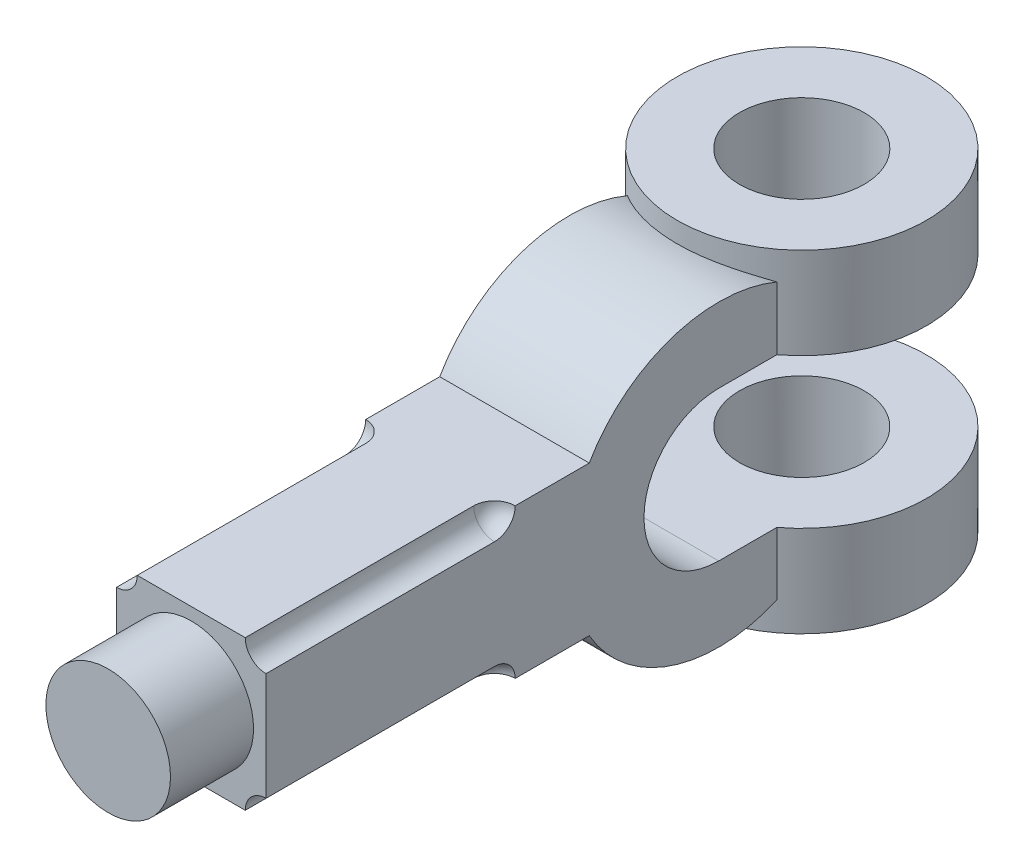
ISO-10303-21;
HEADER;
FILE_DESCRIPTION(('STEP AP214'),'2;1');
FILE_NAME('part.step','',(''),(''),'','','');
FILE_SCHEMA(('AUTOMOTIVE_DESIGN { 1 0 10303 214 1 1 1 1 }'));
ENDSEC;
DATA;
#1=APPLICATION_CONTEXT('core data for automotive mechanical design processes');
#2=APPLICATION_PROTOCOL_DEFINITION('international standard','automotive_design',2000,#1);
#3=PRODUCT_CONTEXT('',#1,'mechanical');
#4=PRODUCT('Part','Part','',(#3));
#5=PRODUCT_RELATED_PRODUCT_CATEGORY('part','',(#4));
#6=PRODUCT_DEFINITION_FORMATION('','',#4);
#7=PRODUCT_DEFINITION_CONTEXT('part definition',#1,'design');
#8=PRODUCT_DEFINITION('design','',#6,#7);
#9=PRODUCT_DEFINITION_SHAPE('','',#8);
#10=(LENGTH_UNIT() NAMED_UNIT(*) SI_UNIT(.MILLI.,.METRE.));
#11=(NAMED_UNIT(*) PLANE_ANGLE_UNIT() SI_UNIT($,.RADIAN.));
#12=(NAMED_UNIT(*) SI_UNIT($,.STERADIAN.) SOLID_ANGLE_UNIT());
#13=UNCERTAINTY_MEASURE_WITH_UNIT(LENGTH_MEASURE(1.E-05),#10,'distance_accuracy_value','');
#14=(GEOMETRIC_REPRESENTATION_CONTEXT(3) GLOBAL_UNCERTAINTY_ASSIGNED_CONTEXT((#13)) GLOBAL_UNIT_ASSIGNED_CONTEXT((#10,
#11,#12)) REPRESENTATION_CONTEXT('',''));
#15=CARTESIAN_POINT('',(0.,0.,0.));
#16=DIRECTION('',(0.,0.,1.));
#17=DIRECTION('',(1.,0.,0.));
#18=AXIS2_PLACEMENT_3D('',#15,#16,#17);
#19=CARTESIAN_POINT('',(-18.,18.,109.));
#20=DIRECTION('',(0.,-1.,0.));
#21=DIRECTION('',(0.,0.,-1.));
#22=AXIS2_PLACEMENT_3D('',#19,#20,#21);
#23=PLANE('',#22);
#24=DIRECTION('',(0.,0.,-1.));
#25=VECTOR('',#24,1.);
#26=CARTESIAN_POINT('',(-13.0000000000001,18.,129.));
#27=LINE('',#26,#25);
#28=CARTESIAN_POINT('',(-13.0000000000001,18.,109.));
#29=VERTEX_POINT('',#28);
#30=CARTESIAN_POINT('',(-13.0000000000001,18.,54.));
#31=VERTEX_POINT('',#30);
#32=EDGE_CURVE('E420',#29,#31,#27,.T.);
#33=ORIENTED_EDGE('',*,*,#32,.F.);
#34=DIRECTION('',(-1.,0.,0.));
#35=VECTOR('',#34,1.);
#36=CARTESIAN_POINT('',(-18.,18.,109.));
#37=LINE('',#36,#35);
#38=CARTESIAN_POINT('',(13.,18.,109.));
#39=VERTEX_POINT('',#38);
#40=EDGE_CURVE('E416',#39,#29,#37,.T.);
#41=ORIENTED_EDGE('',*,*,#40,.F.);
#42=DIRECTION('',(0.,0.,-1.));
#43=VECTOR('',#42,1.);
#44=CARTESIAN_POINT('',(13.,18.,129.));
#45=LINE('',#44,#43);
#46=CARTESIAN_POINT('',(13.,18.,54.));
#47=VERTEX_POINT('',#46);
#48=EDGE_CURVE('E225',#39,#47,#45,.T.);
#49=ORIENTED_EDGE('',*,*,#48,.T.);
#50=CARTESIAN_POINT('',(18.,18.,54.));
#51=DIRECTION('',(0.,-1.,0.));
#52=DIRECTION('',(0.,0.,-1.));
#53=AXIS2_PLACEMENT_3D('',#50,#51,#52);
#54=CIRCLE('',#53,5.);
#55=CARTESIAN_POINT('',(18.,18.,49.));
#56=VERTEX_POINT('',#55);
#57=EDGE_CURVE('E403',#47,#56,#54,.T.);
#58=ORIENTED_EDGE('',*,*,#57,.T.);
#59=DIRECTION('',(0.,0.,-1.));
#60=VECTOR('',#59,1.);
#61=CARTESIAN_POINT('',(18.,18.,109.));
#62=LINE('',#61,#60);
#63=CARTESIAN_POINT('',(18.,18.,31.1769145362398));
#64=VERTEX_POINT('',#63);
#65=EDGE_CURVE('E181',#56,#64,#62,.T.);
#66=ORIENTED_EDGE('',*,*,#65,.T.);
#67=DIRECTION('',(-1.,0.,0.));
#68=VECTOR('',#67,1.);
#69=CARTESIAN_POINT('',(18.,18.,31.1769145362398));
#70=LINE('',#69,#68);
#71=CARTESIAN_POINT('',(-18.,18.,31.1769145362398));
#72=VERTEX_POINT('',#71);
#73=EDGE_CURVE('E185',#64,#72,#70,.T.);
#74=ORIENTED_EDGE('',*,*,#73,.T.);
#75=DIRECTION('',(0.,0.,-1.));
#76=VECTOR('',#75,1.);
#77=CARTESIAN_POINT('',(-18.,18.,109.));
#78=LINE('',#77,#76);
#79=CARTESIAN_POINT('',(-18.0000000000001,17.9999999999999,49.));
#80=VERTEX_POINT('',#79);
#81=EDGE_CURVE('E167',#80,#72,#78,.T.);
#82=ORIENTED_EDGE('',*,*,#81,.F.);
#83=CARTESIAN_POINT('',(-18.0000000000001,18.,54.));
#84=DIRECTION('',(0.,-1.,0.));
#85=DIRECTION('',(0.,0.,-1.));
#86=AXIS2_PLACEMENT_3D('',#83,#84,#85);
#87=CIRCLE('',#86,5.);
#88=EDGE_CURVE('E171',#80,#31,#87,.T.);
#89=ORIENTED_EDGE('',*,*,#88,.T.);
#90=EDGE_LOOP('',(#33,#41,#49,#58,#66,#74,#82,#89));
#91=FACE_BOUND('',#90,.T.);
#92=ADVANCED_FACE('F39',(#91),#23,.F.);
#93=CARTESIAN_POINT('',(-18.,0.,0.));
#94=DIRECTION('',(1.,0.,0.));
#95=DIRECTION('',(0.,0.,-1.));
#96=AXIS2_PLACEMENT_3D('',#93,#94,#95);
#97=PLANE('',#96);
#98=DIRECTION('',(0.,0.,-1.));
#99=VECTOR('',#98,1.);
#100=CARTESIAN_POINT('',(-18.,12.9999999999999,129.));
#101=LINE('',#100,#99);
#102=CARTESIAN_POINT('',(-18.,12.9999999999999,109.));
#103=VERTEX_POINT('',#102);
#104=CARTESIAN_POINT('',(-18.,12.9999999999999,54.));
#105=VERTEX_POINT('',#104);
#106=EDGE_CURVE('E166',#103,#105,#101,.T.);
#107=ORIENTED_EDGE('',*,*,#106,.T.);
#108=CARTESIAN_POINT('',(-18.,17.9999999999999,54.));
#109=DIRECTION('',(1.,0.,0.));
#110=DIRECTION('',(0.,0.,-1.));
#111=AXIS2_PLACEMENT_3D('',#108,#109,#110);
#112=CIRCLE('',#111,5.);
#113=EDGE_CURVE('E165',#105,#80,#112,.T.);
#114=ORIENTED_EDGE('',*,*,#113,.T.);
#115=ORIENTED_EDGE('',*,*,#81,.T.);
#116=CARTESIAN_POINT('',(-18.,0.,0.));
#117=DIRECTION('',(1.,0.,0.));
#118=DIRECTION('',(0.,0.,-1.));
#119=AXIS2_PLACEMENT_3D('',#116,#117,#118);
#120=CIRCLE('',#119,36.);
#121=CARTESIAN_POINT('',(-18.,33.166247903554,-14.));
#122=VERTEX_POINT('',#121);
#123=EDGE_CURVE('E442',#122,#72,#120,.T.);
#124=ORIENTED_EDGE('',*,*,#123,.F.);
#125=DIRECTION('',(0.,-1.,0.));
#126=VECTOR('',#125,1.);
#127=CARTESIAN_POINT('',(-18.,40.,-14.));
#128=LINE('',#127,#126);
#129=CARTESIAN_POINT('',(-18.,18.,-14.));
#130=VERTEX_POINT('',#129);
#131=EDGE_CURVE('E451',#130,#122,#128,.F.);
#132=ORIENTED_EDGE('',*,*,#131,.F.);
#133=DIRECTION('',(0.,0.,1.));
#134=VECTOR('',#133,1.);
#135=CARTESIAN_POINT('',(-18.,18.,0.));
#136=LINE('',#135,#134);
#137=CARTESIAN_POINT('',(-18.,18.,0.));
#138=VERTEX_POINT('',#137);
#139=EDGE_CURVE('E249',#130,#138,#136,.T.);
#140=ORIENTED_EDGE('',*,*,#139,.T.);
#141=CARTESIAN_POINT('',(-18.,0.,0.));
#142=DIRECTION('',(1.,0.,0.));
#143=DIRECTION('',(0.,0.,-1.));
#144=AXIS2_PLACEMENT_3D('',#141,#142,#143);
#145=CIRCLE('',#144,18.);
#146=CARTESIAN_POINT('',(-18.,-18.,0.));
#147=VERTEX_POINT('',#146);
#148=EDGE_CURVE('E459',#138,#147,#145,.T.);
#149=ORIENTED_EDGE('',*,*,#148,.T.);
#150=DIRECTION('',(0.,0.,-1.));
#151=VECTOR('',#150,1.);
#152=CARTESIAN_POINT('',(-18.,-18.,0.));
#153=LINE('',#152,#151);
#154=CARTESIAN_POINT('',(-18.,-18.,-14.));
#155=VERTEX_POINT('',#154);
#156=EDGE_CURVE('E239',#147,#155,#153,.T.);
#157=ORIENTED_EDGE('',*,*,#156,.T.);
#158=CARTESIAN_POINT('',(-18.,-33.166247903554,-14.));
#159=VERTEX_POINT('',#158);
#160=EDGE_CURVE('E446',#159,#155,#128,.F.);
#161=ORIENTED_EDGE('',*,*,#160,.F.);
#162=CARTESIAN_POINT('',(-18.,-18.,31.1769145362398));
#163=VERTEX_POINT('',#162);
#164=EDGE_CURVE('E449',#163,#159,#120,.T.);
#165=ORIENTED_EDGE('',*,*,#164,.F.);
#166=DIRECTION('',(0.,0.,-1.));
#167=VECTOR('',#166,1.);
#168=CARTESIAN_POINT('',(-18.,-18.,109.));
#169=LINE('',#168,#167);
#170=CARTESIAN_POINT('',(-18.,-18.,49.));
#171=VERTEX_POINT('',#170);
#172=EDGE_CURVE('E184',#171,#163,#169,.T.);
#173=ORIENTED_EDGE('',*,*,#172,.F.);
#174=CARTESIAN_POINT('',(-18.,-18.,54.));
#175=DIRECTION('',(1.,0.,0.));
#176=DIRECTION('',(0.,0.,-1.));
#177=AXIS2_PLACEMENT_3D('',#174,#175,#176);
#178=CIRCLE('',#177,5.);
#179=CARTESIAN_POINT('',(-18.,-13.,54.));
#180=VERTEX_POINT('',#179);
#181=EDGE_CURVE('E193',#171,#180,#178,.T.);
#182=ORIENTED_EDGE('',*,*,#181,.T.);
#183=DIRECTION('',(0.,0.,-1.));
#184=VECTOR('',#183,1.);
#185=CARTESIAN_POINT('',(-18.,-13.,129.));
#186=LINE('',#185,#184);
#187=CARTESIAN_POINT('',(-18.,-13.,109.));
#188=VERTEX_POINT('',#187);
#189=EDGE_CURVE('E211',#188,#180,#186,.T.);
#190=ORIENTED_EDGE('',*,*,#189,.F.);
#191=DIRECTION('',(0.,-1.,0.));
#192=VECTOR('',#191,1.);
#193=CARTESIAN_POINT('',(-18.,18.,109.));
#194=LINE('',#193,#192);
#195=EDGE_CURVE('E425',#103,#188,#194,.T.);
#196=ORIENTED_EDGE('',*,*,#195,.F.);
#197=EDGE_LOOP('',(#107,#114,#115,#124,#132,#140,#149,#157,#161,#165,#173,#182,#190,#196));
#198=FACE_BOUND('',#197,.T.);
#199=ADVANCED_FACE('F163',(#198),#97,.F.);
#200=CARTESIAN_POINT('',(-18.,-18.,109.));
#201=DIRECTION('',(0.,1.,0.));
#202=DIRECTION('',(0.,0.,1.));
#203=AXIS2_PLACEMENT_3D('',#200,#201,#202);
#204=PLANE('',#203);
#205=DIRECTION('',(0.,0.,-1.));
#206=VECTOR('',#205,1.);
#207=CARTESIAN_POINT('',(-13.,-18.,129.));
#208=LINE('',#207,#206);
#209=CARTESIAN_POINT('',(-13.,-18.,109.));
#210=VERTEX_POINT('',#209);
#211=CARTESIAN_POINT('',(-13.,-18.,54.));
#212=VERTEX_POINT('',#211);
#213=EDGE_CURVE('E212',#210,#212,#208,.T.);
#214=ORIENTED_EDGE('',*,*,#213,.T.);
#215=CARTESIAN_POINT('',(-18.,-18.,54.));
#216=DIRECTION('',(0.,1.,0.));
#217=DIRECTION('',(0.,0.,1.));
#218=AXIS2_PLACEMENT_3D('',#215,#216,#217);
#219=CIRCLE('',#218,5.);
#220=EDGE_CURVE('E197',#212,#171,#219,.T.);
#221=ORIENTED_EDGE('',*,*,#220,.T.);
#222=ORIENTED_EDGE('',*,*,#172,.T.);
#223=DIRECTION('',(-1.,0.,0.));
#224=VECTOR('',#223,1.);
#225=CARTESIAN_POINT('',(18.,-18.,31.1769145362398));
#226=LINE('',#225,#224);
#227=CARTESIAN_POINT('',(18.,-18.,31.1769145362398));
#228=VERTEX_POINT('',#227);
#229=EDGE_CURVE('E440',#163,#228,#226,.F.);
#230=ORIENTED_EDGE('',*,*,#229,.T.);
#231=DIRECTION('',(0.,0.,-1.));
#232=VECTOR('',#231,1.);
#233=CARTESIAN_POINT('',(18.,-18.,109.));
#234=LINE('',#233,#232);
#235=CARTESIAN_POINT('',(18.0000000000002,-17.9999999999998,49.));
#236=VERTEX_POINT('',#235);
#237=EDGE_CURVE('E433',#236,#228,#234,.T.);
#238=ORIENTED_EDGE('',*,*,#237,.F.);
#239=CARTESIAN_POINT('',(18.0000000000002,-18.,54.));
#240=DIRECTION('',(0.,1.,0.));
#241=DIRECTION('',(0.,0.,1.));
#242=AXIS2_PLACEMENT_3D('',#239,#240,#241);
#243=CIRCLE('',#242,5.);
#244=CARTESIAN_POINT('',(13.0000000000002,-17.9999999999999,54.));
#245=VERTEX_POINT('',#244);
#246=EDGE_CURVE('E50',#236,#245,#243,.T.);
#247=ORIENTED_EDGE('',*,*,#246,.T.);
#248=DIRECTION('',(0.,0.,-1.));
#249=VECTOR('',#248,1.);
#250=CARTESIAN_POINT('',(13.0000000000002,-17.9999999999999,129.));
#251=LINE('',#250,#249);
#252=CARTESIAN_POINT('',(13.0000000000002,-17.9999999999999,109.));
#253=VERTEX_POINT('',#252);
#254=EDGE_CURVE('E202',#253,#245,#251,.T.);
#255=ORIENTED_EDGE('',*,*,#254,.F.);
#256=DIRECTION('',(1.,0.,0.));
#257=VECTOR('',#256,1.);
#258=CARTESIAN_POINT('',(-18.,-18.,109.));
#259=LINE('',#258,#257);
#260=EDGE_CURVE('E422',#210,#253,#259,.T.);
#261=ORIENTED_EDGE('',*,*,#260,.F.);
#262=EDGE_LOOP('',(#214,#221,#222,#230,#238,#247,#255,#261));
#263=FACE_BOUND('',#262,.T.);
#264=ADVANCED_FACE('F302',(#263),#204,.F.);
#265=CARTESIAN_POINT('',(0.,40.,-38.));
#266=DIRECTION('',(0.,-1.,0.));
#267=DIRECTION('',(0.,0.,-1.));
#268=AXIS2_PLACEMENT_3D('',#265,#266,#267);
#269=CYLINDRICAL_SURFACE('',#268,30.);
#270=CARTESIAN_POINT('',(0.,-40.,-38.));
#271=DIRECTION('',(0.,1.,0.));
#272=DIRECTION('',(0.,0.,1.));
#273=AXIS2_PLACEMENT_3D('',#270,#271,#272);
#274=CIRCLE('',#273,30.);
#275=CARTESIAN_POINT('',(0.,-40.,-7.99999999999999));
#276=VERTEX_POINT('',#275);
#277=EDGE_CURVE('E251',#276,#276,#274,.T.);
#278=ORIENTED_EDGE('',*,*,#277,.T.);
#279=EDGE_LOOP('',(#278));
#280=FACE_BOUND('',#279,.T.);
#281=ORIENTED_EDGE('',*,*,#160,.T.);
#282=CARTESIAN_POINT('',(0.,-18.,-38.));
#283=DIRECTION('',(0.,-1.,0.));
#284=DIRECTION('',(0.,0.,-1.));
#285=AXIS2_PLACEMENT_3D('',#282,#283,#284);
#286=CIRCLE('',#285,30.);
#287=CARTESIAN_POINT('',(18.,-18.,-14.));
#288=VERTEX_POINT('',#287);
#289=EDGE_CURVE('E454',#155,#288,#286,.T.);
#290=ORIENTED_EDGE('',*,*,#289,.T.);
#291=DIRECTION('',(0.,-1.,0.));
#292=VECTOR('',#291,1.);
#293=CARTESIAN_POINT('',(18.,40.,-14.));
#294=LINE('',#293,#292);
#295=CARTESIAN_POINT('',(18.,-33.166247903554,-14.));
#296=VERTEX_POINT('',#295);
#297=EDGE_CURVE('E483',#296,#288,#294,.F.);
#298=ORIENTED_EDGE('',*,*,#297,.F.);
#299=CARTESIAN_POINT('',(18.,-33.166247903554,-14.));
#300=CARTESIAN_POINT('',(17.6930773777975,-33.263419446848,-13.7697914669123));
#301=CARTESIAN_POINT('',(17.3807230808146,-33.3555956399313,-13.544741843491));
#302=CARTESIAN_POINT('',(16.7458117593949,-33.5305340399841,-13.1056926079693));
#303=CARTESIAN_POINT('',(16.4232554498747,-33.6132969047424,-12.8916922243363));
#304=CARTESIAN_POINT('',(15.7687219472756,-33.7699594578544,-12.475545740944));
#305=CARTESIAN_POINT('',(15.4367495645329,-33.8438635744564,-12.2733937445412));
#306=CARTESIAN_POINT('',(14.76392069967,-33.9834406043319,-11.8814568623378));
#307=CARTESIAN_POINT('',(14.4230640822397,-34.0491133921508,-11.6916721650497));
#308=CARTESIAN_POINT('',(13.3898149323075,-34.2343632879063,-11.1426025540428));
#309=CARTESIAN_POINT('',(12.6850207126412,-34.3425762976838,-10.8025055379531));
#310=CARTESIAN_POINT('',(11.2480786922758,-34.5329783098244,-10.1774367289205));
#311=CARTESIAN_POINT('',(10.5159280210739,-34.6151645725883,-9.89247074034745));
#312=CARTESIAN_POINT('',(9.03065060570019,-34.7573389624575,-9.38071667984849));
#313=CARTESIAN_POINT('',(8.27755532285062,-34.8173586347135,-9.15384607489728));
#314=CARTESIAN_POINT('',(6.75472436138253,-34.918594443344,-8.75974787780039));
#315=CARTESIAN_POINT('',(5.98498904121515,-34.959810984344,-8.59251900223835));
#316=CARTESIAN_POINT('',(4.4337504337043,-35.0259082143418,-8.31898915831244));
#317=CARTESIAN_POINT('',(3.65224234730016,-35.0507820463512,-8.21271376686622));
#318=CARTESIAN_POINT('',(2.08295067012214,-35.08574964332,-8.06201887454369));
#319=CARTESIAN_POINT('',(1.29516692612192,-35.0958430462818,-8.01760088866062));
#320=CARTESIAN_POINT('',(-0.308110669466011,-35.1020223114319,-7.99051279517599));
#321=CARTESIAN_POINT('',(-1.12364324754118,-35.097624410164,-8.00997512202942));
#322=CARTESIAN_POINT('',(-2.75020056679914,-35.073440650782,-8.11521102353957));
#323=CARTESIAN_POINT('',(-3.56122523039219,-35.0536545286285,-8.20098573601985));
#324=CARTESIAN_POINT('',(-5.17289427923022,-34.9973268273269,-8.438125149817));
#325=CARTESIAN_POINT('',(-5.97354060276967,-34.9607884246405,-8.5894774164326));
#326=CARTESIAN_POINT('',(-7.55888261424725,-34.8685671957176,-8.95649345064364));
#327=CARTESIAN_POINT('',(-8.34357766378275,-34.8128836048429,-9.17215978682801));
#328=CARTESIAN_POINT('',(-9.92134698997989,-34.6764464400433,-9.67546901847601));
#329=CARTESIAN_POINT('',(-10.713554237814,-34.5947997148027,-9.96559128184525));
#330=CARTESIAN_POINT('',(-12.2678626925185,-34.4025995560303,-10.6100956781708));
#331=CARTESIAN_POINT('',(-13.0299664451626,-34.2920485729061,-10.9644723630693));
#332=CARTESIAN_POINT('',(-14.1463062636235,-34.1004041805666,-11.541381794425));
#333=CARTESIAN_POINT('',(-14.5144831605483,-34.0320975846488,-11.7415774087341));
#334=CARTESIAN_POINT('',(-15.2407742435037,-33.8861508028502,-12.1563625857165));
#335=CARTESIAN_POINT('',(-15.5988886102234,-33.8085107846985,-12.3709518896929));
#336=CARTESIAN_POINT('',(-16.3043982299195,-33.6431291994053,-12.8138900489744));
#337=CARTESIAN_POINT('',(-16.6517872785986,-33.5553819193586,-13.0422466508426));
#338=CARTESIAN_POINT('',(-17.334871119648,-33.3690916049028,-13.5117519843456));
#339=CARTESIAN_POINT('',(-17.6705649077954,-33.2705476464246,-13.7529018100179));
#340=CARTESIAN_POINT('',(-18.,-33.166247903554,-14.));
#341=B_SPLINE_CURVE_WITH_KNOTS('',3,(#299,#300,#301,#302,#303,#304,#305,#306,#307,#308,#309,
#310,#311,#312,#313,#314,#315,#316,#317,#318,#319,#320,#321,#322,#323,#324,#325,#326,#327,#328,
#329,#330,#331,#332,#333,#334,#335,#336,#337,#338,#339,#340),.UNSPECIFIED.,.F.,.F.,(4,2,2,2,2,2,
2,2,2,2,2,2,2,2,2,2,2,2,2,2,4),(0.,1.1872068815055,2.37433075178232,3.5608587142209,
4.7474047584617,7.11427346215102,9.48139122185354,11.8451272494444,14.2088124092853,
16.5734886795475,18.9382228637417,21.3826882525449,23.8271955857303,26.2712395984218,
28.7153812349374,31.2548581592331,33.7941198648306,35.0675833221724,36.3410238977694,
37.6151878224434,38.889460885922),.UNSPECIFIED.);
#342=EDGE_CURVE('E268',#296,#159,#341,.T.);
#343=ORIENTED_EDGE('',*,*,#342,.T.);
#344=EDGE_LOOP('',(#281,#290,#298,#343));
#345=FACE_BOUND('',#344,.T.);
#346=ADVANCED_FACE('F287',(#280,#345),#269,.T.);
#347=CARTESIAN_POINT('',(18.,0.,0.));
#348=DIRECTION('',(-1.,0.,0.));
#349=DIRECTION('',(0.,0.,1.));
#350=AXIS2_PLACEMENT_3D('',#347,#348,#349);
#351=CYLINDRICAL_SURFACE('',#350,36.);
#352=ORIENTED_EDGE('',*,*,#342,.F.);
#353=CARTESIAN_POINT('',(18.,0.,0.));
#354=DIRECTION('',(1.,0.,0.));
#355=DIRECTION('',(0.,0.,-1.));
#356=AXIS2_PLACEMENT_3D('',#353,#354,#355);
#357=CIRCLE('',#356,36.);
#358=EDGE_CURVE('E445',#228,#296,#357,.T.);
#359=ORIENTED_EDGE('',*,*,#358,.F.);
#360=ORIENTED_EDGE('',*,*,#229,.F.);
#361=ORIENTED_EDGE('',*,*,#164,.T.);
#362=EDGE_LOOP('',(#352,#359,#360,#361));
#363=FACE_BOUND('',#362,.T.);
#364=ADVANCED_FACE('F273',(#363),#351,.T.);
#365=CARTESIAN_POINT('',(-18.,33.166247903554,-14.));
#366=CARTESIAN_POINT('',(-17.6930773777975,33.263419446848,-13.7697914669123));
#367=CARTESIAN_POINT('',(-17.3807230808146,33.3555956399313,-13.544741843491));
#368=CARTESIAN_POINT('',(-16.7458117593949,33.5305340399841,-13.1056926079693));
#369=CARTESIAN_POINT('',(-16.4232554498747,33.6132969047424,-12.8916922243363));
#370=CARTESIAN_POINT('',(-15.7687219472756,33.7699594578544,-12.475545740944));
#371=CARTESIAN_POINT('',(-15.4367495645329,33.8438635744564,-12.2733937445412));
#372=CARTESIAN_POINT('',(-14.76392069967,33.9834406043319,-11.8814568623378));
#373=CARTESIAN_POINT('',(-14.4230640822397,34.0491133921508,-11.6916721650497));
#374=CARTESIAN_POINT('',(-13.3898149323075,34.2343632879063,-11.1426025540428));
#375=CARTESIAN_POINT('',(-12.6850207126412,34.3425762976838,-10.8025055379531));
#376=CARTESIAN_POINT('',(-11.2480786922758,34.5329783098244,-10.1774367289205));
#377=CARTESIAN_POINT('',(-10.5159280210739,34.6151645725883,-9.89247074034745));
#378=CARTESIAN_POINT('',(-9.03065060570019,34.7573389624575,-9.38071667984849));
#379=CARTESIAN_POINT('',(-8.27755532285062,34.8173586347135,-9.15384607489728));
#380=CARTESIAN_POINT('',(-6.75472436138253,34.918594443344,-8.75974787780039));
#381=CARTESIAN_POINT('',(-5.98498904121515,34.959810984344,-8.59251900223835));
#382=CARTESIAN_POINT('',(-4.4337504337043,35.0259082143418,-8.31898915831244));
#383=CARTESIAN_POINT('',(-3.65224234730016,35.0507820463512,-8.21271376686622));
#384=CARTESIAN_POINT('',(-2.08295067012214,35.08574964332,-8.06201887454369));
#385=CARTESIAN_POINT('',(-1.29516692612192,35.0958430462818,-8.01760088866062));
#386=CARTESIAN_POINT('',(0.308110669466011,35.1020223114319,-7.99051279517599));
#387=CARTESIAN_POINT('',(1.12364324754118,35.097624410164,-8.00997512202942));
#388=CARTESIAN_POINT('',(2.75020056679914,35.073440650782,-8.11521102353957));
#389=CARTESIAN_POINT('',(3.56122523039219,35.0536545286285,-8.20098573601985));
#390=CARTESIAN_POINT('',(5.17289427923022,34.9973268273269,-8.438125149817));
#391=CARTESIAN_POINT('',(5.97354060276967,34.9607884246405,-8.5894774164326));
#392=CARTESIAN_POINT('',(7.55888261424725,34.8685671957176,-8.95649345064364));
#393=CARTESIAN_POINT('',(8.34357766378275,34.8128836048429,-9.17215978682801));
#394=CARTESIAN_POINT('',(9.92134698997989,34.6764464400433,-9.67546901847601));
#395=CARTESIAN_POINT('',(10.713554237814,34.5947997148027,-9.96559128184525));
#396=CARTESIAN_POINT('',(12.2678626925185,34.4025995560303,-10.6100956781708));
#397=CARTESIAN_POINT('',(13.0299664451626,34.2920485729061,-10.9644723630693));
#398=CARTESIAN_POINT('',(14.1463062636235,34.1004041805666,-11.541381794425));
#399=CARTESIAN_POINT('',(14.5144831605483,34.0320975846488,-11.7415774087341));
#400=CARTESIAN_POINT('',(15.2407742435037,33.8861508028502,-12.1563625857165));
#401=CARTESIAN_POINT('',(15.5988886102234,33.8085107846985,-12.3709518896929));
#402=CARTESIAN_POINT('',(16.3043982299195,33.6431291994053,-12.8138900489744));
#403=CARTESIAN_POINT('',(16.6517872785986,33.5553819193586,-13.0422466508426));
#404=CARTESIAN_POINT('',(17.334871119648,33.3690916049028,-13.5117519843456));
#405=CARTESIAN_POINT('',(17.6705649077954,33.2705476464246,-13.7529018100179));
#406=CARTESIAN_POINT('',(18.,33.166247903554,-14.));
#407=B_SPLINE_CURVE_WITH_KNOTS('',3,(#365,#366,#367,#368,#369,#370,#371,#372,#373,#374,#375,
#376,#377,#378,#379,#380,#381,#382,#383,#384,#385,#386,#387,#388,#389,#390,#391,#392,#393,#394,
#395,#396,#397,#398,#399,#400,#401,#402,#403,#404,#405,#406),.UNSPECIFIED.,.F.,.F.,(4,2,2,2,2,2,
2,2,2,2,2,2,2,2,2,2,2,2,2,2,4),(0.,1.1872068815055,2.37433075178232,3.5608587142209,
4.7474047584617,7.11427346215102,9.48139122185354,11.8451272494444,14.2088124092853,
16.5734886795475,18.9382228637417,21.3826882525449,23.8271955857303,26.2712395984218,
28.7153812349374,31.2548581592331,33.7941198648306,35.0675833221724,36.3410238977694,
37.6151878224434,38.889460885922),.UNSPECIFIED.);
#408=CARTESIAN_POINT('',(18.,33.166247903554,-14.));
#409=VERTEX_POINT('',#408);
#410=EDGE_CURVE('E260',#122,#409,#407,.T.);
#411=ORIENTED_EDGE('',*,*,#410,.F.);
#412=ORIENTED_EDGE('',*,*,#123,.T.);
#413=ORIENTED_EDGE('',*,*,#73,.F.);
#414=EDGE_CURVE('E448',#409,#64,#357,.T.);
#415=ORIENTED_EDGE('',*,*,#414,.F.);
#416=EDGE_LOOP('',(#411,#412,#413,#415));
#417=FACE_BOUND('',#416,.T.);
#418=ADVANCED_FACE('F307',(#417),#351,.T.);
#419=CARTESIAN_POINT('',(18.,0.,0.));
#420=DIRECTION('',(1.,0.,0.));
#421=DIRECTION('',(0.,0.,-1.));
#422=AXIS2_PLACEMENT_3D('',#419,#420,#421);
#423=PLANE('',#422);
#424=DIRECTION('',(0.,0.,-1.));
#425=VECTOR('',#424,1.);
#426=CARTESIAN_POINT('',(18.0000000000001,-12.9999999999998,129.));
#427=LINE('',#426,#425);
#428=CARTESIAN_POINT('',(18.,-12.9999999999998,109.));
#429=VERTEX_POINT('',#428);
#430=CARTESIAN_POINT('',(18.0000000000001,-12.9999999999998,54.));
#431=VERTEX_POINT('',#430);
#432=EDGE_CURVE('E201',#429,#431,#427,.T.);
#433=ORIENTED_EDGE('',*,*,#432,.T.);
#434=CARTESIAN_POINT('',(18.,-17.9999999999998,54.));
#435=DIRECTION('',(1.,0.,0.));
#436=DIRECTION('',(0.,0.,-1.));
#437=AXIS2_PLACEMENT_3D('',#434,#435,#436);
#438=CIRCLE('',#437,5.);
#439=EDGE_CURVE('E11',#431,#236,#438,.F.);
#440=ORIENTED_EDGE('',*,*,#439,.T.);
#441=ORIENTED_EDGE('',*,*,#237,.T.);
#442=ORIENTED_EDGE('',*,*,#358,.T.);
#443=ORIENTED_EDGE('',*,*,#297,.T.);
#444=DIRECTION('',(0.,0.,-1.));
#445=VECTOR('',#444,1.);
#446=CARTESIAN_POINT('',(18.,-18.,0.));
#447=LINE('',#446,#445);
#448=CARTESIAN_POINT('',(18.,-18.,0.));
#449=VERTEX_POINT('',#448);
#450=EDGE_CURVE('E245',#449,#288,#447,.T.);
#451=ORIENTED_EDGE('',*,*,#450,.F.);
#452=CARTESIAN_POINT('',(18.,0.,0.));
#453=DIRECTION('',(1.,0.,0.));
#454=DIRECTION('',(0.,0.,-1.));
#455=AXIS2_PLACEMENT_3D('',#452,#453,#454);
#456=CIRCLE('',#455,18.);
#457=CARTESIAN_POINT('',(18.,18.,0.));
#458=VERTEX_POINT('',#457);
#459=EDGE_CURVE('E253',#458,#449,#456,.T.);
#460=ORIENTED_EDGE('',*,*,#459,.F.);
#461=DIRECTION('',(0.,0.,1.));
#462=VECTOR('',#461,1.);
#463=CARTESIAN_POINT('',(18.,18.,0.));
#464=LINE('',#463,#462);
#465=CARTESIAN_POINT('',(18.,18.,-14.));
#466=VERTEX_POINT('',#465);
#467=EDGE_CURVE('E247',#466,#458,#464,.T.);
#468=ORIENTED_EDGE('',*,*,#467,.F.);
#469=EDGE_CURVE('E482',#466,#409,#294,.F.);
#470=ORIENTED_EDGE('',*,*,#469,.T.);
#471=ORIENTED_EDGE('',*,*,#414,.T.);
#472=ORIENTED_EDGE('',*,*,#65,.F.);
#473=CARTESIAN_POINT('',(18.,18.,54.));
#474=DIRECTION('',(1.,0.,0.));
#475=DIRECTION('',(0.,0.,-1.));
#476=AXIS2_PLACEMENT_3D('',#473,#474,#475);
#477=CIRCLE('',#476,5.);
#478=CARTESIAN_POINT('',(18.,13.,54.));
#479=VERTEX_POINT('',#478);
#480=EDGE_CURVE('E407',#56,#479,#477,.F.);
#481=ORIENTED_EDGE('',*,*,#480,.T.);
#482=DIRECTION('',(0.,0.,-1.));
#483=VECTOR('',#482,1.);
#484=CARTESIAN_POINT('',(18.,13.,129.));
#485=LINE('',#484,#483);
#486=CARTESIAN_POINT('',(18.,13.,109.));
#487=VERTEX_POINT('',#486);
#488=EDGE_CURVE('E218',#487,#479,#485,.T.);
#489=ORIENTED_EDGE('',*,*,#488,.F.);
#490=DIRECTION('',(0.,1.,0.));
#491=VECTOR('',#490,1.);
#492=CARTESIAN_POINT('',(18.,18.,109.));
#493=LINE('',#492,#491);
#494=EDGE_CURVE('E209',#429,#487,#493,.T.);
#495=ORIENTED_EDGE('',*,*,#494,.F.);
#496=EDGE_LOOP('',(#433,#440,#441,#442,#443,#451,#460,#468,#470,#471,#472,#481,#489,#495));
#497=FACE_BOUND('',#496,.T.);
#498=ADVANCED_FACE('F208',(#497),#423,.T.);
#499=CARTESIAN_POINT('',(0.,0.,109.));
#500=DIRECTION('',(0.,0.,1.));
#501=DIRECTION('',(1.,0.,0.));
#502=AXIS2_PLACEMENT_3D('',#499,#500,#501);
#503=PLANE('',#502);
#504=CARTESIAN_POINT('',(0.,0.,109.));
#505=DIRECTION('',(0.,0.,1.));
#506=DIRECTION('',(1.,0.,0.));
#507=AXIS2_PLACEMENT_3D('',#504,#505,#506);
#508=CIRCLE('',#507,15.);
#509=CARTESIAN_POINT('',(15.,0.,109.));
#510=VERTEX_POINT('',#509);
#511=EDGE_CURVE('E443',#510,#510,#508,.T.);
#512=ORIENTED_EDGE('',*,*,#511,.F.);
#513=EDGE_LOOP('',(#512));
#514=FACE_BOUND('',#513,.T.);
#515=ORIENTED_EDGE('',*,*,#40,.T.);
#516=CARTESIAN_POINT('',(-18.0000000000001,17.9999999999999,109.));
#517=DIRECTION('',(0.,0.,1.));
#518=DIRECTION('',(1.,0.,0.));
#519=AXIS2_PLACEMENT_3D('',#516,#517,#518);
#520=CIRCLE('',#519,5.);
#521=EDGE_CURVE('E190',#29,#103,#520,.F.);
#522=ORIENTED_EDGE('',*,*,#521,.T.);
#523=ORIENTED_EDGE('',*,*,#195,.T.);
#524=CARTESIAN_POINT('',(-18.,-18.,109.));
#525=DIRECTION('',(0.,0.,1.));
#526=DIRECTION('',(1.,0.,0.));
#527=AXIS2_PLACEMENT_3D('',#524,#525,#526);
#528=CIRCLE('',#527,5.);
#529=EDGE_CURVE('E470',#188,#210,#528,.F.);
#530=ORIENTED_EDGE('',*,*,#529,.T.);
#531=ORIENTED_EDGE('',*,*,#260,.T.);
#532=CARTESIAN_POINT('',(18.0000000000002,-17.9999999999998,109.));
#533=DIRECTION('',(0.,0.,1.));
#534=DIRECTION('',(1.,0.,0.));
#535=AXIS2_PLACEMENT_3D('',#532,#533,#534);
#536=CIRCLE('',#535,5.);
#537=EDGE_CURVE('E406',#253,#429,#536,.F.);
#538=ORIENTED_EDGE('',*,*,#537,.T.);
#539=ORIENTED_EDGE('',*,*,#494,.T.);
#540=CARTESIAN_POINT('',(18.,18.,109.));
#541=DIRECTION('',(0.,0.,1.));
#542=DIRECTION('',(1.,0.,0.));
#543=AXIS2_PLACEMENT_3D('',#540,#541,#542);
#544=CIRCLE('',#543,5.);
#545=EDGE_CURVE('E411',#487,#39,#544,.F.);
#546=ORIENTED_EDGE('',*,*,#545,.T.);
#547=EDGE_LOOP('',(#515,#522,#523,#530,#531,#538,#539,#546));
#548=FACE_BOUND('',#547,.T.);
#549=ADVANCED_FACE('F298',(#514,#548),#503,.T.);
#550=CARTESIAN_POINT('',(0.,0.,129.));
#551=DIRECTION('',(0.,0.,-1.));
#552=DIRECTION('',(-1.,0.,0.));
#553=AXIS2_PLACEMENT_3D('',#550,#551,#552);
#554=CYLINDRICAL_SURFACE('',#553,15.);
#555=CARTESIAN_POINT('',(0.,0.,129.));
#556=DIRECTION('',(0.,0.,1.));
#557=DIRECTION('',(1.,0.,0.));
#558=AXIS2_PLACEMENT_3D('',#555,#556,#557);
#559=CIRCLE('',#558,15.);
#560=CARTESIAN_POINT('',(15.,0.,129.));
#561=VERTEX_POINT('',#560);
#562=EDGE_CURVE('E430',#561,#561,#559,.T.);
#563=ORIENTED_EDGE('',*,*,#562,.F.);
#564=EDGE_LOOP('',(#563));
#565=FACE_BOUND('',#564,.T.);
#566=ORIENTED_EDGE('',*,*,#511,.T.);
#567=EDGE_LOOP('',(#566));
#568=FACE_BOUND('',#567,.T.);
#569=ADVANCED_FACE('F295',(#565,#568),#554,.T.);
#570=CARTESIAN_POINT('',(0.,0.,129.));
#571=DIRECTION('',(0.,0.,1.));
#572=DIRECTION('',(1.,0.,0.));
#573=AXIS2_PLACEMENT_3D('',#570,#571,#572);
#574=PLANE('',#573);
#575=ORIENTED_EDGE('',*,*,#562,.T.);
#576=EDGE_LOOP('',(#575));
#577=FACE_BOUND('',#576,.T.);
#578=ADVANCED_FACE('F285',(#577),#574,.T.);
#579=CARTESIAN_POINT('',(0.,18.,-38.));
#580=DIRECTION('',(0.,1.,0.));
#581=DIRECTION('',(0.,0.,1.));
#582=AXIS2_PLACEMENT_3D('',#579,#580,#581);
#583=CIRCLE('',#582,30.);
#584=EDGE_CURVE('E460',#466,#130,#583,.T.);
#585=ORIENTED_EDGE('',*,*,#584,.T.);
#586=ORIENTED_EDGE('',*,*,#131,.T.);
#587=ORIENTED_EDGE('',*,*,#410,.T.);
#588=ORIENTED_EDGE('',*,*,#469,.F.);
#589=EDGE_LOOP('',(#585,#586,#587,#588));
#590=FACE_BOUND('',#589,.T.);
#591=CARTESIAN_POINT('',(0.,40.,-38.));
#592=DIRECTION('',(0.,1.,0.));
#593=DIRECTION('',(0.,0.,1.));
#594=AXIS2_PLACEMENT_3D('',#591,#592,#593);
#595=CIRCLE('',#594,30.);
#596=CARTESIAN_POINT('',(0.,40.,-7.99999999999999));
#597=VERTEX_POINT('',#596);
#598=EDGE_CURVE('E255',#597,#597,#595,.T.);
#599=ORIENTED_EDGE('',*,*,#598,.F.);
#600=EDGE_LOOP('',(#599));
#601=FACE_BOUND('',#600,.T.);
#602=ADVANCED_FACE('F279',(#590,#601),#269,.T.);
#603=CARTESIAN_POINT('',(0.,40.,-38.));
#604=DIRECTION('',(0.,1.,0.));
#605=DIRECTION('',(0.,0.,1.));
#606=AXIS2_PLACEMENT_3D('',#603,#604,#605);
#607=PLANE('',#606);
#608=CARTESIAN_POINT('',(0.,40.,-38.));
#609=DIRECTION('',(0.,1.,0.));
#610=DIRECTION('',(0.,0.,1.));
#611=AXIS2_PLACEMENT_3D('',#608,#609,#610);
#612=CIRCLE('',#611,15.);
#613=CARTESIAN_POINT('',(0.,40.,-23.));
#614=VERTEX_POINT('',#613);
#615=EDGE_CURVE('E223',#614,#614,#612,.T.);
#616=ORIENTED_EDGE('',*,*,#615,.F.);
#617=EDGE_LOOP('',(#616));
#618=FACE_BOUND('',#617,.T.);
#619=ORIENTED_EDGE('',*,*,#598,.T.);
#620=EDGE_LOOP('',(#619));
#621=FACE_BOUND('',#620,.T.);
#622=ADVANCED_FACE('F282',(#618,#621),#607,.T.);
#623=CARTESIAN_POINT('',(0.,-40.,-38.));
#624=DIRECTION('',(0.,1.,0.));
#625=DIRECTION('',(0.,0.,1.));
#626=AXIS2_PLACEMENT_3D('',#623,#624,#625);
#627=PLANE('',#626);
#628=CARTESIAN_POINT('',(0.,-40.,-38.));
#629=DIRECTION('',(0.,1.,0.));
#630=DIRECTION('',(0.,0.,1.));
#631=AXIS2_PLACEMENT_3D('',#628,#629,#630);
#632=CIRCLE('',#631,15.);
#633=CARTESIAN_POINT('',(0.,-40.,-23.));
#634=VERTEX_POINT('',#633);
#635=EDGE_CURVE('E227',#634,#634,#632,.T.);
#636=ORIENTED_EDGE('',*,*,#635,.T.);
#637=EDGE_LOOP('',(#636));
#638=FACE_BOUND('',#637,.T.);
#639=ORIENTED_EDGE('',*,*,#277,.F.);
#640=EDGE_LOOP('',(#639));
#641=FACE_BOUND('',#640,.T.);
#642=ADVANCED_FACE('F290',(#638,#641),#627,.F.);
#643=CARTESIAN_POINT('',(-30.,0.,0.));
#644=DIRECTION('',(1.,0.,0.));
#645=DIRECTION('',(0.,0.,-1.));
#646=AXIS2_PLACEMENT_3D('',#643,#644,#645);
#647=CYLINDRICAL_SURFACE('',#646,18.);
#648=ORIENTED_EDGE('',*,*,#459,.T.);
#649=DIRECTION('',(1.,0.,0.));
#650=VECTOR('',#649,1.);
#651=CARTESIAN_POINT('',(-30.,-18.,0.));
#652=LINE('',#651,#650);
#653=EDGE_CURVE('E233',#147,#449,#652,.T.);
#654=ORIENTED_EDGE('',*,*,#653,.F.);
#655=ORIENTED_EDGE('',*,*,#148,.F.);
#656=DIRECTION('',(1.,0.,0.));
#657=VECTOR('',#656,1.);
#658=CARTESIAN_POINT('',(-30.,18.,0.));
#659=LINE('',#658,#657);
#660=EDGE_CURVE('E237',#138,#458,#659,.T.);
#661=ORIENTED_EDGE('',*,*,#660,.T.);
#662=EDGE_LOOP('',(#648,#654,#655,#661));
#663=FACE_BOUND('',#662,.T.);
#664=ADVANCED_FACE('F515',(#663),#647,.F.);
#665=CARTESIAN_POINT('',(-30.,18.,0.));
#666=DIRECTION('',(0.,1.,0.));
#667=DIRECTION('',(0.,0.,1.));
#668=AXIS2_PLACEMENT_3D('',#665,#666,#667);
#669=PLANE('',#668);
#670=CARTESIAN_POINT('',(0.,18.,-38.));
#671=DIRECTION('',(0.,1.,0.));
#672=DIRECTION('',(0.,0.,1.));
#673=AXIS2_PLACEMENT_3D('',#670,#671,#672);
#674=CIRCLE('',#673,15.);
#675=CARTESIAN_POINT('',(0.,18.,-23.));
#676=VERTEX_POINT('',#675);
#677=EDGE_CURVE('E232',#676,#676,#674,.T.);
#678=ORIENTED_EDGE('',*,*,#677,.T.);
#679=EDGE_LOOP('',(#678));
#680=FACE_BOUND('',#679,.T.);
#681=ORIENTED_EDGE('',*,*,#139,.F.);
#682=ORIENTED_EDGE('',*,*,#584,.F.);
#683=ORIENTED_EDGE('',*,*,#467,.T.);
#684=ORIENTED_EDGE('',*,*,#660,.F.);
#685=EDGE_LOOP('',(#681,#682,#683,#684));
#686=FACE_BOUND('',#685,.T.);
#687=ADVANCED_FACE('F520',(#680,#686),#669,.F.);
#688=CARTESIAN_POINT('',(-30.,-18.,-68.));
#689=DIRECTION('',(0.,-1.,0.));
#690=DIRECTION('',(0.,0.,-1.));
#691=AXIS2_PLACEMENT_3D('',#688,#689,#690);
#692=PLANE('',#691);
#693=CARTESIAN_POINT('',(0.,-18.,-38.));
#694=DIRECTION('',(0.,-1.,0.));
#695=DIRECTION('',(0.,0.,-1.));
#696=AXIS2_PLACEMENT_3D('',#693,#694,#695);
#697=CIRCLE('',#696,15.);
#698=CARTESIAN_POINT('',(0.,-18.,-53.));
#699=VERTEX_POINT('',#698);
#700=EDGE_CURVE('E235',#699,#699,#697,.T.);
#701=ORIENTED_EDGE('',*,*,#700,.T.);
#702=EDGE_LOOP('',(#701));
#703=FACE_BOUND('',#702,.T.);
#704=ORIENTED_EDGE('',*,*,#450,.T.);
#705=ORIENTED_EDGE('',*,*,#289,.F.);
#706=ORIENTED_EDGE('',*,*,#156,.F.);
#707=ORIENTED_EDGE('',*,*,#653,.T.);
#708=EDGE_LOOP('',(#704,#705,#706,#707));
#709=FACE_BOUND('',#708,.T.);
#710=ADVANCED_FACE('F533',(#703,#709),#692,.F.);
#711=CARTESIAN_POINT('',(0.,40.,-38.));
#712=DIRECTION('',(0.,1.,0.));
#713=DIRECTION('',(0.,0.,1.));
#714=AXIS2_PLACEMENT_3D('',#711,#712,#713);
#715=CYLINDRICAL_SURFACE('',#714,15.);
#716=ORIENTED_EDGE('',*,*,#615,.T.);
#717=EDGE_LOOP('',(#716));
#718=FACE_BOUND('',#717,.T.);
#719=ORIENTED_EDGE('',*,*,#677,.F.);
#720=EDGE_LOOP('',(#719));
#721=FACE_BOUND('',#720,.T.);
#722=ADVANCED_FACE('F527',(#718,#721),#715,.F.);
#723=ORIENTED_EDGE('',*,*,#635,.F.);
#724=EDGE_LOOP('',(#723));
#725=FACE_BOUND('',#724,.T.);
#726=ORIENTED_EDGE('',*,*,#700,.F.);
#727=EDGE_LOOP('',(#726));
#728=FACE_BOUND('',#727,.T.);
#729=ADVANCED_FACE('F398',(#725,#728),#715,.F.);
#730=CARTESIAN_POINT('',(18.,18.,129.));
#731=DIRECTION('',(0.,0.,-1.));
#732=DIRECTION('',(-1.,0.,0.));
#733=AXIS2_PLACEMENT_3D('',#730,#731,#732);
#734=CYLINDRICAL_SURFACE('',#733,5.);
#735=ORIENTED_EDGE('',*,*,#488,.T.);
#736=CARTESIAN_POINT('',(18.,18.,54.));
#737=DIRECTION('',(0.,0.,-1.));
#738=DIRECTION('',(-1.,0.,0.));
#739=AXIS2_PLACEMENT_3D('',#736,#737,#738);
#740=CIRCLE('',#739,5.);
#741=EDGE_CURVE('E409',#479,#47,#740,.T.);
#742=ORIENTED_EDGE('',*,*,#741,.T.);
#743=ORIENTED_EDGE('',*,*,#48,.F.);
#744=ORIENTED_EDGE('',*,*,#545,.F.);
#745=EDGE_LOOP('',(#735,#742,#743,#744));
#746=FACE_BOUND('',#745,.T.);
#747=ADVANCED_FACE('F397',(#746),#734,.F.);
#748=CARTESIAN_POINT('',(18.,18.,54.));
#749=DIRECTION('',(0.,0.,1.));
#750=DIRECTION('',(1.,0.,0.));
#751=AXIS2_PLACEMENT_3D('',#748,#749,#750);
#752=SPHERICAL_SURFACE('',#751,5.);
#753=ORIENTED_EDGE('',*,*,#57,.F.);
#754=ORIENTED_EDGE('',*,*,#741,.F.);
#755=ORIENTED_EDGE('',*,*,#480,.F.);
#756=EDGE_LOOP('',(#753,#754,#755));
#757=FACE_BOUND('',#756,.T.);
#758=ADVANCED_FACE('F342',(#757),#752,.F.);
#759=CARTESIAN_POINT('',(18.0000000000002,-17.9999999999998,129.));
#760=DIRECTION('',(0.,0.,-1.));
#761=DIRECTION('',(-1.,0.,0.));
#762=AXIS2_PLACEMENT_3D('',#759,#760,#761);
#763=CYLINDRICAL_SURFACE('',#762,5.);
#764=ORIENTED_EDGE('',*,*,#254,.T.);
#765=CARTESIAN_POINT('',(18.0000000000002,-17.9999999999998,54.));
#766=DIRECTION('',(0.,0.,-1.));
#767=DIRECTION('',(-1.,0.,0.));
#768=AXIS2_PLACEMENT_3D('',#765,#766,#767);
#769=CIRCLE('',#768,5.);
#770=EDGE_CURVE('E200',#245,#431,#769,.T.);
#771=ORIENTED_EDGE('',*,*,#770,.T.);
#772=ORIENTED_EDGE('',*,*,#432,.F.);
#773=ORIENTED_EDGE('',*,*,#537,.F.);
#774=EDGE_LOOP('',(#764,#771,#772,#773));
#775=FACE_BOUND('',#774,.T.);
#776=ADVANCED_FACE('F205',(#775),#763,.F.);
#777=CARTESIAN_POINT('',(-18.,-18.,129.));
#778=DIRECTION('',(0.,0.,-1.));
#779=DIRECTION('',(-1.,0.,0.));
#780=AXIS2_PLACEMENT_3D('',#777,#778,#779);
#781=CYLINDRICAL_SURFACE('',#780,5.);
#782=ORIENTED_EDGE('',*,*,#189,.T.);
#783=CARTESIAN_POINT('',(-18.,-18.,54.));
#784=DIRECTION('',(0.,0.,-1.));
#785=DIRECTION('',(-1.,0.,0.));
#786=AXIS2_PLACEMENT_3D('',#783,#784,#785);
#787=CIRCLE('',#786,5.);
#788=EDGE_CURVE('E175',#180,#212,#787,.T.);
#789=ORIENTED_EDGE('',*,*,#788,.T.);
#790=ORIENTED_EDGE('',*,*,#213,.F.);
#791=ORIENTED_EDGE('',*,*,#529,.F.);
#792=EDGE_LOOP('',(#782,#789,#790,#791));
#793=FACE_BOUND('',#792,.T.);
#794=ADVANCED_FACE('F336',(#793),#781,.F.);
#795=CARTESIAN_POINT('',(-18.0000000000001,17.9999999999999,129.));
#796=DIRECTION('',(0.,0.,-1.));
#797=DIRECTION('',(-1.,0.,0.));
#798=AXIS2_PLACEMENT_3D('',#795,#796,#797);
#799=CYLINDRICAL_SURFACE('',#798,5.);
#800=ORIENTED_EDGE('',*,*,#32,.T.);
#801=CARTESIAN_POINT('',(-18.0000000000001,17.9999999999999,54.));
#802=DIRECTION('',(0.,0.,-1.));
#803=DIRECTION('',(-1.,0.,0.));
#804=AXIS2_PLACEMENT_3D('',#801,#802,#803);
#805=CIRCLE('',#804,5.);
#806=EDGE_CURVE('E189',#31,#105,#805,.T.);
#807=ORIENTED_EDGE('',*,*,#806,.T.);
#808=ORIENTED_EDGE('',*,*,#106,.F.);
#809=ORIENTED_EDGE('',*,*,#521,.F.);
#810=EDGE_LOOP('',(#800,#807,#808,#809));
#811=FACE_BOUND('',#810,.T.);
#812=ADVANCED_FACE('F349',(#811),#799,.F.);
#813=CARTESIAN_POINT('',(-18.0000000000001,17.9999999999999,54.));
#814=DIRECTION('',(0.,0.,1.));
#815=DIRECTION('',(1.,0.,0.));
#816=AXIS2_PLACEMENT_3D('',#813,#814,#815);
#817=SPHERICAL_SURFACE('',#816,5.);
#818=ORIENTED_EDGE('',*,*,#113,.F.);
#819=ORIENTED_EDGE('',*,*,#806,.F.);
#820=ORIENTED_EDGE('',*,*,#88,.F.);
#821=EDGE_LOOP('',(#818,#819,#820));
#822=FACE_BOUND('',#821,.T.);
#823=ADVANCED_FACE('F188',(#822),#817,.F.);
#824=CARTESIAN_POINT('',(-18.,-18.,54.));
#825=DIRECTION('',(0.,0.,1.));
#826=DIRECTION('',(1.,0.,0.));
#827=AXIS2_PLACEMENT_3D('',#824,#825,#826);
#828=SPHERICAL_SURFACE('',#827,5.);
#829=ORIENTED_EDGE('',*,*,#220,.F.);
#830=ORIENTED_EDGE('',*,*,#788,.F.);
#831=ORIENTED_EDGE('',*,*,#181,.F.);
#832=EDGE_LOOP('',(#829,#830,#831));
#833=FACE_BOUND('',#832,.T.);
#834=ADVANCED_FACE('F368',(#833),#828,.F.);
#835=CARTESIAN_POINT('',(18.0000000000002,-17.9999999999998,54.));
#836=DIRECTION('',(0.,0.,1.));
#837=DIRECTION('',(1.,0.,0.));
#838=AXIS2_PLACEMENT_3D('',#835,#836,#837);
#839=SPHERICAL_SURFACE('',#838,5.);
#840=ORIENTED_EDGE('',*,*,#439,.F.);
#841=ORIENTED_EDGE('',*,*,#770,.F.);
#842=ORIENTED_EDGE('',*,*,#246,.F.);
#843=EDGE_LOOP('',(#840,#841,#842));
#844=FACE_BOUND('',#843,.T.);
#845=ADVANCED_FACE('F41',(#844),#839,.F.);
#846=CLOSED_SHELL('',(#92,#199,#264,#346,#364,#418,#498,#549,#569,#578,#602,#622,#642,#664,#687,
#710,#722,#729,#747,#758,#776,#794,#812,#823,#834,#845));
#847=MANIFOLD_SOLID_BREP('B2',#846);
#848=ADVANCED_BREP_SHAPE_REPRESENTATION('',(#18,#847),#14);
#849=SHAPE_DEFINITION_REPRESENTATION(#9,#848);
ENDSEC;
END-ISO-10303-21;
